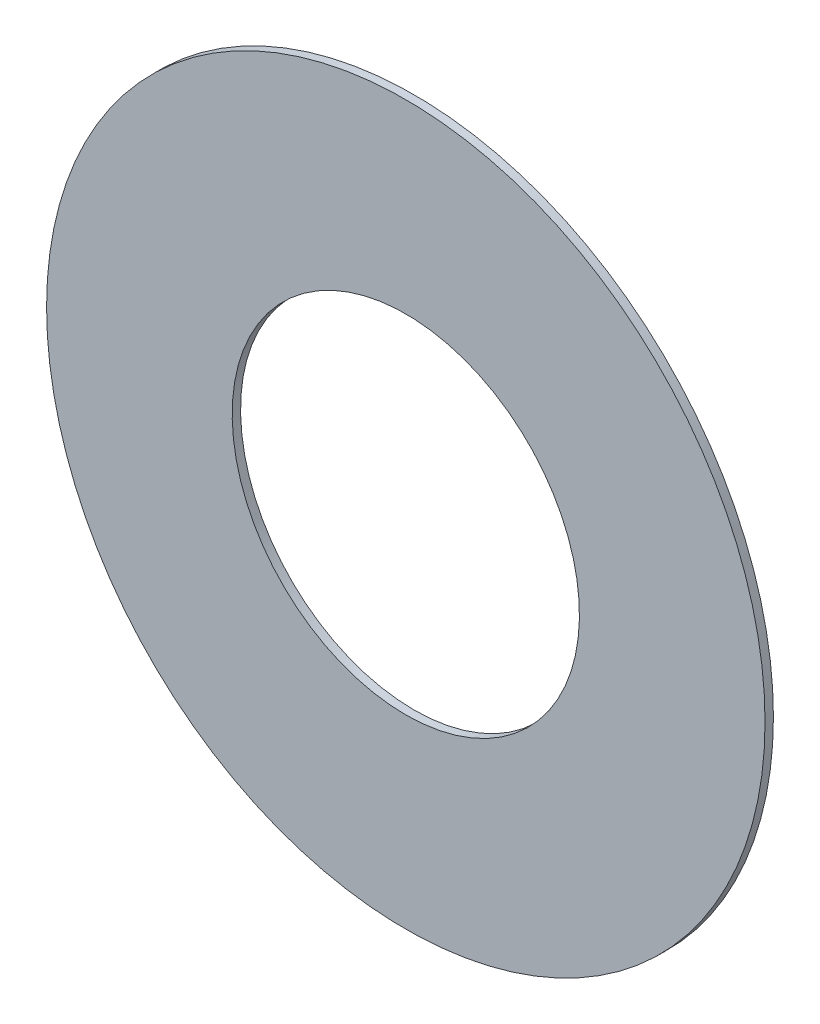
ISO-10303-21;
HEADER;
FILE_DESCRIPTION(('STEP AP214'),'2;1');
FILE_NAME('part.step','',(''),(''),'','','');
FILE_SCHEMA(('AUTOMOTIVE_DESIGN { 1 0 10303 214 1 1 1 1 }'));
ENDSEC;
DATA;
#1=APPLICATION_CONTEXT('core data for automotive mechanical design processes');
#2=APPLICATION_PROTOCOL_DEFINITION('international standard','automotive_design',2000,#1);
#3=PRODUCT_CONTEXT('',#1,'mechanical');
#4=PRODUCT('Part','Part','',(#3));
#5=PRODUCT_RELATED_PRODUCT_CATEGORY('part','',(#4));
#6=PRODUCT_DEFINITION_FORMATION('','',#4);
#7=PRODUCT_DEFINITION_CONTEXT('part definition',#1,'design');
#8=PRODUCT_DEFINITION('design','',#6,#7);
#9=PRODUCT_DEFINITION_SHAPE('','',#8);
#10=(LENGTH_UNIT() NAMED_UNIT(*) SI_UNIT(.MILLI.,.METRE.));
#11=(NAMED_UNIT(*) PLANE_ANGLE_UNIT() SI_UNIT($,.RADIAN.));
#12=(NAMED_UNIT(*) SI_UNIT($,.STERADIAN.) SOLID_ANGLE_UNIT());
#13=UNCERTAINTY_MEASURE_WITH_UNIT(LENGTH_MEASURE(1.E-05),#10,'distance_accuracy_value','');
#14=(GEOMETRIC_REPRESENTATION_CONTEXT(3) GLOBAL_UNCERTAINTY_ASSIGNED_CONTEXT((#13)) GLOBAL_UNIT_ASSIGNED_CONTEXT((#10,
#11,#12)) REPRESENTATION_CONTEXT('',''));
#15=CARTESIAN_POINT('',(0.,0.,0.));
#16=DIRECTION('',(0.,0.,1.));
#17=DIRECTION('',(1.,0.,0.));
#18=AXIS2_PLACEMENT_3D('',#15,#16,#17);
#19=CARTESIAN_POINT('',(3.4641,2.,-0.045));
#20=DIRECTION('',(0.,0.,-1.));
#21=DIRECTION('',(0.,-1.,0.));
#22=AXIS2_PLACEMENT_3D('',#19,#20,#21);
#23=CYLINDRICAL_SURFACE('',#22,0.725);
#24=CARTESIAN_POINT('',(3.4641,2.,-0.035));
#25=DIRECTION('',(0.,0.,-1.));
#26=DIRECTION('',(0.,-1.,0.));
#27=AXIS2_PLACEMENT_3D('',#24,#25,#26);
#28=CIRCLE('',#27,0.725);
#29=CARTESIAN_POINT('',(3.4641,1.275,-0.035));
#30=VERTEX_POINT('',#29);
#31=EDGE_CURVE('E25',#30,#30,#28,.T.);
#32=ORIENTED_EDGE('',*,*,#31,.T.);
#33=DIRECTION('',(0.,0.,1.));
#34=VECTOR('',#33,1.);
#35=CARTESIAN_POINT('',(3.4641,1.275,-0.045));
#36=LINE('',#35,#34);
#37=CARTESIAN_POINT('',(3.4641,1.275,0.));
#38=VERTEX_POINT('',#37);
#39=EDGE_CURVE('E11',#30,#38,#36,.T.);
#40=ORIENTED_EDGE('',*,*,#39,.T.);
#41=CARTESIAN_POINT('',(3.4641,2.,0.));
#42=DIRECTION('',(0.,0.,-1.));
#43=DIRECTION('',(0.,-1.,0.));
#44=AXIS2_PLACEMENT_3D('',#41,#42,#43);
#45=CIRCLE('',#44,0.725);
#46=EDGE_CURVE('E69',#38,#38,#45,.T.);
#47=ORIENTED_EDGE('',*,*,#46,.F.);
#48=ORIENTED_EDGE('',*,*,#39,.F.);
#49=EDGE_LOOP('',(#32,#40,#47,#48));
#50=FACE_BOUND('',#49,.T.);
#51=ADVANCED_FACE('F17',(#50),#23,.F.);
#52=CARTESIAN_POINT('',(3.4641,2.,-0.035));
#53=DIRECTION('',(0.,0.,1.));
#54=DIRECTION('',(1.,0.,0.));
#55=AXIS2_PLACEMENT_3D('',#52,#53,#54);
#56=PLANE('',#55);
#57=ORIENTED_EDGE('',*,*,#31,.F.);
#58=EDGE_LOOP('',(#57));
#59=FACE_BOUND('',#58,.T.);
#60=CARTESIAN_POINT('',(3.4641,2.,-0.035));
#61=DIRECTION('',(0.,0.,1.));
#62=DIRECTION('',(1.,0.,0.));
#63=AXIS2_PLACEMENT_3D('',#60,#61,#62);
#64=CIRCLE('',#63,1.5);
#65=CARTESIAN_POINT('',(4.9641,2.,-0.035));
#66=VERTEX_POINT('',#65);
#67=EDGE_CURVE('E56',#66,#66,#64,.T.);
#68=ORIENTED_EDGE('',*,*,#67,.F.);
#69=EDGE_LOOP('',(#68));
#70=FACE_BOUND('',#69,.T.);
#71=ADVANCED_FACE('F76',(#59,#70),#56,.F.);
#72=CARTESIAN_POINT('',(3.4641,2.,0.));
#73=DIRECTION('',(0.,0.,1.));
#74=DIRECTION('',(1.,0.,0.));
#75=AXIS2_PLACEMENT_3D('',#72,#73,#74);
#76=PLANE('',#75);
#77=ORIENTED_EDGE('',*,*,#46,.T.);
#78=EDGE_LOOP('',(#77));
#79=FACE_BOUND('',#78,.T.);
#80=CARTESIAN_POINT('',(3.4641,2.,0.));
#81=DIRECTION('',(0.,0.,1.));
#82=DIRECTION('',(1.,0.,0.));
#83=AXIS2_PLACEMENT_3D('',#80,#81,#82);
#84=CIRCLE('',#83,1.5);
#85=CARTESIAN_POINT('',(4.9641,2.,0.));
#86=VERTEX_POINT('',#85);
#87=EDGE_CURVE('E54',#86,#86,#84,.T.);
#88=ORIENTED_EDGE('',*,*,#87,.T.);
#89=EDGE_LOOP('',(#88));
#90=FACE_BOUND('',#89,.T.);
#91=ADVANCED_FACE('F60',(#79,#90),#76,.T.);
#92=CARTESIAN_POINT('',(3.4641,2.,-0.035));
#93=DIRECTION('',(0.,0.,1.));
#94=DIRECTION('',(1.,0.,0.));
#95=AXIS2_PLACEMENT_3D('',#92,#93,#94);
#96=CYLINDRICAL_SURFACE('',#95,1.5);
#97=ORIENTED_EDGE('',*,*,#87,.F.);
#98=DIRECTION('',(0.,0.,1.));
#99=VECTOR('',#98,1.);
#100=CARTESIAN_POINT('',(4.9641,2.,-0.035));
#101=LINE('',#100,#99);
#102=EDGE_CURVE('E51',#66,#86,#101,.T.);
#103=ORIENTED_EDGE('',*,*,#102,.F.);
#104=ORIENTED_EDGE('',*,*,#67,.T.);
#105=ORIENTED_EDGE('',*,*,#102,.T.);
#106=EDGE_LOOP('',(#97,#103,#104,#105));
#107=FACE_BOUND('',#106,.T.);
#108=ADVANCED_FACE('F53',(#107),#96,.T.);
#109=CLOSED_SHELL('',(#51,#71,#91,#108));
#110=MANIFOLD_SOLID_BREP('B1',#109);
#111=ADVANCED_BREP_SHAPE_REPRESENTATION('',(#18,#110),#14);
#112=SHAPE_DEFINITION_REPRESENTATION(#9,#111);
ENDSEC;
END-ISO-10303-21;
